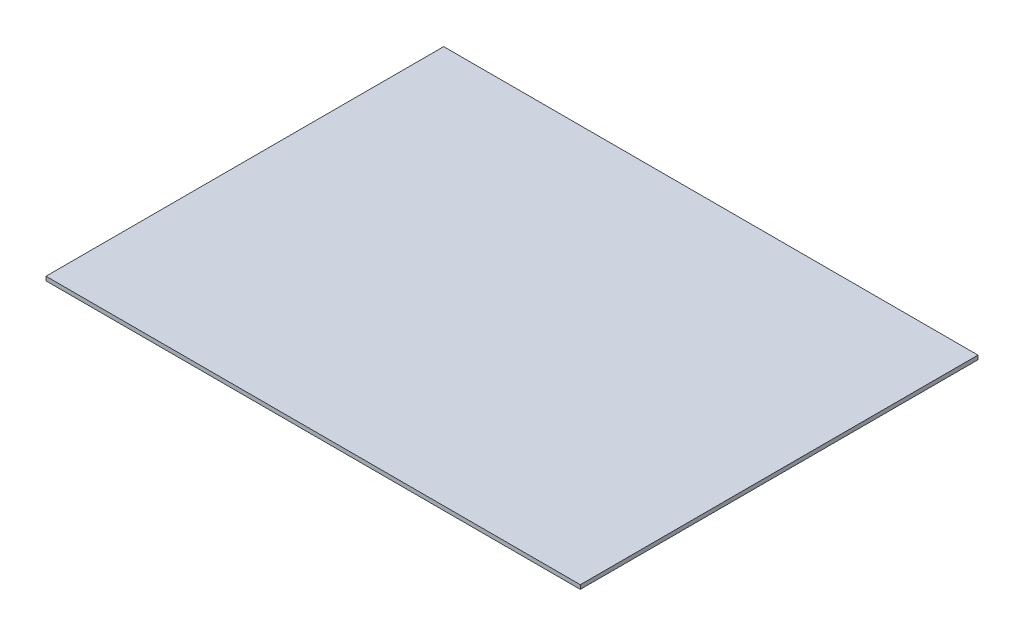
ISO-10303-21;
HEADER;
FILE_DESCRIPTION(('STEP AP214'),'2;1');
FILE_NAME('part.step','',(''),(''),'','','');
FILE_SCHEMA(('AUTOMOTIVE_DESIGN { 1 0 10303 214 1 1 1 1 }'));
ENDSEC;
DATA;
#1=APPLICATION_CONTEXT('core data for automotive mechanical design processes');
#2=APPLICATION_PROTOCOL_DEFINITION('international standard','automotive_design',2000,#1);
#3=PRODUCT_CONTEXT('',#1,'mechanical');
#4=PRODUCT('Part','Part','',(#3));
#5=PRODUCT_RELATED_PRODUCT_CATEGORY('part','',(#4));
#6=PRODUCT_DEFINITION_FORMATION('','',#4);
#7=PRODUCT_DEFINITION_CONTEXT('part definition',#1,'design');
#8=PRODUCT_DEFINITION('design','',#6,#7);
#9=PRODUCT_DEFINITION_SHAPE('','',#8);
#10=(LENGTH_UNIT() NAMED_UNIT(*) SI_UNIT(.MILLI.,.METRE.));
#11=(NAMED_UNIT(*) PLANE_ANGLE_UNIT() SI_UNIT($,.RADIAN.));
#12=(NAMED_UNIT(*) SI_UNIT($,.STERADIAN.) SOLID_ANGLE_UNIT());
#13=UNCERTAINTY_MEASURE_WITH_UNIT(LENGTH_MEASURE(1.E-05),#10,'distance_accuracy_value','');
#14=(GEOMETRIC_REPRESENTATION_CONTEXT(3) GLOBAL_UNCERTAINTY_ASSIGNED_CONTEXT((#13)) GLOBAL_UNIT_ASSIGNED_CONTEXT((#10,
#11,#12)) REPRESENTATION_CONTEXT('',''));
#15=CARTESIAN_POINT('',(0.,0.,0.));
#16=DIRECTION('',(0.,0.,1.));
#17=DIRECTION('',(1.,0.,0.));
#18=AXIS2_PLACEMENT_3D('',#15,#16,#17);
#19=CARTESIAN_POINT('',(197.5,3.,-147.));
#20=DIRECTION('',(-1.,0.,0.));
#21=DIRECTION('',(0.,0.,1.));
#22=AXIS2_PLACEMENT_3D('',#19,#20,#21);
#23=PLANE('',#22);
#24=DIRECTION('',(0.,0.,-1.));
#25=VECTOR('',#24,1.);
#26=CARTESIAN_POINT('',(197.5,0.,-147.));
#27=LINE('',#26,#25);
#28=CARTESIAN_POINT('',(197.5,0.,147.));
#29=VERTEX_POINT('',#28);
#30=CARTESIAN_POINT('',(197.5,0.,-147.));
#31=VERTEX_POINT('',#30);
#32=EDGE_CURVE('E101',#29,#31,#27,.T.);
#33=ORIENTED_EDGE('',*,*,#32,.T.);
#34=DIRECTION('',(0.,-1.,0.));
#35=VECTOR('',#34,1.);
#36=CARTESIAN_POINT('',(197.5,3.,-147.));
#37=LINE('',#36,#35);
#38=CARTESIAN_POINT('',(197.5,3.,-147.));
#39=VERTEX_POINT('',#38);
#40=EDGE_CURVE('E11',#39,#31,#37,.T.);
#41=ORIENTED_EDGE('',*,*,#40,.F.);
#42=DIRECTION('',(0.,0.,-1.));
#43=VECTOR('',#42,1.);
#44=CARTESIAN_POINT('',(197.5,3.,-147.));
#45=LINE('',#44,#43);
#46=CARTESIAN_POINT('',(197.5,3.,147.));
#47=VERTEX_POINT('',#46);
#48=EDGE_CURVE('E89',#47,#39,#45,.T.);
#49=ORIENTED_EDGE('',*,*,#48,.F.);
#50=DIRECTION('',(0.,-1.,0.));
#51=VECTOR('',#50,1.);
#52=CARTESIAN_POINT('',(197.5,3.,147.));
#53=LINE('',#52,#51);
#54=EDGE_CURVE('E97',#47,#29,#53,.T.);
#55=ORIENTED_EDGE('',*,*,#54,.T.);
#56=EDGE_LOOP('',(#33,#41,#49,#55));
#57=FACE_BOUND('',#56,.T.);
#58=ADVANCED_FACE('F38',(#57),#23,.F.);
#59=CARTESIAN_POINT('',(-197.5,3.,-147.));
#60=DIRECTION('',(0.,0.,1.));
#61=DIRECTION('',(1.,0.,0.));
#62=AXIS2_PLACEMENT_3D('',#59,#60,#61);
#63=PLANE('',#62);
#64=DIRECTION('',(-1.,0.,0.));
#65=VECTOR('',#64,1.);
#66=CARTESIAN_POINT('',(-197.5,0.,-147.));
#67=LINE('',#66,#65);
#68=CARTESIAN_POINT('',(-197.5,0.,-147.));
#69=VERTEX_POINT('',#68);
#70=EDGE_CURVE('E93',#31,#69,#67,.T.);
#71=ORIENTED_EDGE('',*,*,#70,.T.);
#72=DIRECTION('',(0.,-1.,0.));
#73=VECTOR('',#72,1.);
#74=CARTESIAN_POINT('',(-197.5,3.,-147.));
#75=LINE('',#74,#73);
#76=CARTESIAN_POINT('',(-197.5,3.,-147.));
#77=VERTEX_POINT('',#76);
#78=EDGE_CURVE('E46',#77,#69,#75,.T.);
#79=ORIENTED_EDGE('',*,*,#78,.F.);
#80=DIRECTION('',(-1.,0.,0.));
#81=VECTOR('',#80,1.);
#82=CARTESIAN_POINT('',(-197.5,3.,-147.));
#83=LINE('',#82,#81);
#84=EDGE_CURVE('E84',#39,#77,#83,.T.);
#85=ORIENTED_EDGE('',*,*,#84,.F.);
#86=ORIENTED_EDGE('',*,*,#40,.T.);
#87=EDGE_LOOP('',(#71,#79,#85,#86));
#88=FACE_BOUND('',#87,.T.);
#89=ADVANCED_FACE('F92',(#88),#63,.F.);
#90=CARTESIAN_POINT('',(-197.5,3.,-147.));
#91=DIRECTION('',(1.,0.,0.));
#92=DIRECTION('',(0.,0.,-1.));
#93=AXIS2_PLACEMENT_3D('',#90,#91,#92);
#94=PLANE('',#93);
#95=DIRECTION('',(0.,0.,1.));
#96=VECTOR('',#95,1.);
#97=CARTESIAN_POINT('',(-197.5,0.,-147.));
#98=LINE('',#97,#96);
#99=CARTESIAN_POINT('',(-197.5,0.,147.));
#100=VERTEX_POINT('',#99);
#101=EDGE_CURVE('E71',#69,#100,#98,.T.);
#102=ORIENTED_EDGE('',*,*,#101,.T.);
#103=DIRECTION('',(0.,-1.,0.));
#104=VECTOR('',#103,1.);
#105=CARTESIAN_POINT('',(-197.5,3.,147.));
#106=LINE('',#105,#104);
#107=CARTESIAN_POINT('',(-197.5,3.,147.));
#108=VERTEX_POINT('',#107);
#109=EDGE_CURVE('E94',#108,#100,#106,.T.);
#110=ORIENTED_EDGE('',*,*,#109,.F.);
#111=DIRECTION('',(0.,0.,1.));
#112=VECTOR('',#111,1.);
#113=CARTESIAN_POINT('',(-197.5,3.,-147.));
#114=LINE('',#113,#112);
#115=EDGE_CURVE('E87',#77,#108,#114,.T.);
#116=ORIENTED_EDGE('',*,*,#115,.F.);
#117=ORIENTED_EDGE('',*,*,#78,.T.);
#118=EDGE_LOOP('',(#102,#110,#116,#117));
#119=FACE_BOUND('',#118,.T.);
#120=ADVANCED_FACE('F95',(#119),#94,.F.);
#121=CARTESIAN_POINT('',(-197.5,3.,147.));
#122=DIRECTION('',(0.,0.,-1.));
#123=DIRECTION('',(-1.,0.,0.));
#124=AXIS2_PLACEMENT_3D('',#121,#122,#123);
#125=PLANE('',#124);
#126=DIRECTION('',(1.,0.,0.));
#127=VECTOR('',#126,1.);
#128=CARTESIAN_POINT('',(-197.5,0.,147.));
#129=LINE('',#128,#127);
#130=EDGE_CURVE('E77',#100,#29,#129,.T.);
#131=ORIENTED_EDGE('',*,*,#130,.T.);
#132=ORIENTED_EDGE('',*,*,#54,.F.);
#133=DIRECTION('',(1.,0.,0.));
#134=VECTOR('',#133,1.);
#135=CARTESIAN_POINT('',(-197.5,3.,147.));
#136=LINE('',#135,#134);
#137=EDGE_CURVE('E54',#108,#47,#136,.T.);
#138=ORIENTED_EDGE('',*,*,#137,.F.);
#139=ORIENTED_EDGE('',*,*,#109,.T.);
#140=EDGE_LOOP('',(#131,#132,#138,#139));
#141=FACE_BOUND('',#140,.T.);
#142=ADVANCED_FACE('F108',(#141),#125,.F.);
#143=CARTESIAN_POINT('',(0.,3.,0.));
#144=DIRECTION('',(0.,1.,0.));
#145=DIRECTION('',(0.,0.,1.));
#146=AXIS2_PLACEMENT_3D('',#143,#144,#145);
#147=PLANE('',#146);
#148=ORIENTED_EDGE('',*,*,#48,.T.);
#149=ORIENTED_EDGE('',*,*,#84,.T.);
#150=ORIENTED_EDGE('',*,*,#115,.T.);
#151=ORIENTED_EDGE('',*,*,#137,.T.);
#152=EDGE_LOOP('',(#148,#149,#150,#151));
#153=FACE_BOUND('',#152,.T.);
#154=ADVANCED_FACE('F85',(#153),#147,.T.);
#155=CARTESIAN_POINT('',(0.,0.,0.));
#156=DIRECTION('',(0.,1.,0.));
#157=DIRECTION('',(0.,0.,1.));
#158=AXIS2_PLACEMENT_3D('',#155,#156,#157);
#159=PLANE('',#158);
#160=ORIENTED_EDGE('',*,*,#32,.F.);
#161=ORIENTED_EDGE('',*,*,#130,.F.);
#162=ORIENTED_EDGE('',*,*,#101,.F.);
#163=ORIENTED_EDGE('',*,*,#70,.F.);
#164=EDGE_LOOP('',(#160,#161,#162,#163));
#165=FACE_BOUND('',#164,.T.);
#166=ADVANCED_FACE('F111',(#165),#159,.F.);
#167=CLOSED_SHELL('',(#58,#89,#120,#142,#154,#166));
#168=MANIFOLD_SOLID_BREP('B2',#167);
#169=ADVANCED_BREP_SHAPE_REPRESENTATION('',(#18,#168),#14);
#170=SHAPE_DEFINITION_REPRESENTATION(#9,#169);
ENDSEC;
END-ISO-10303-21;
